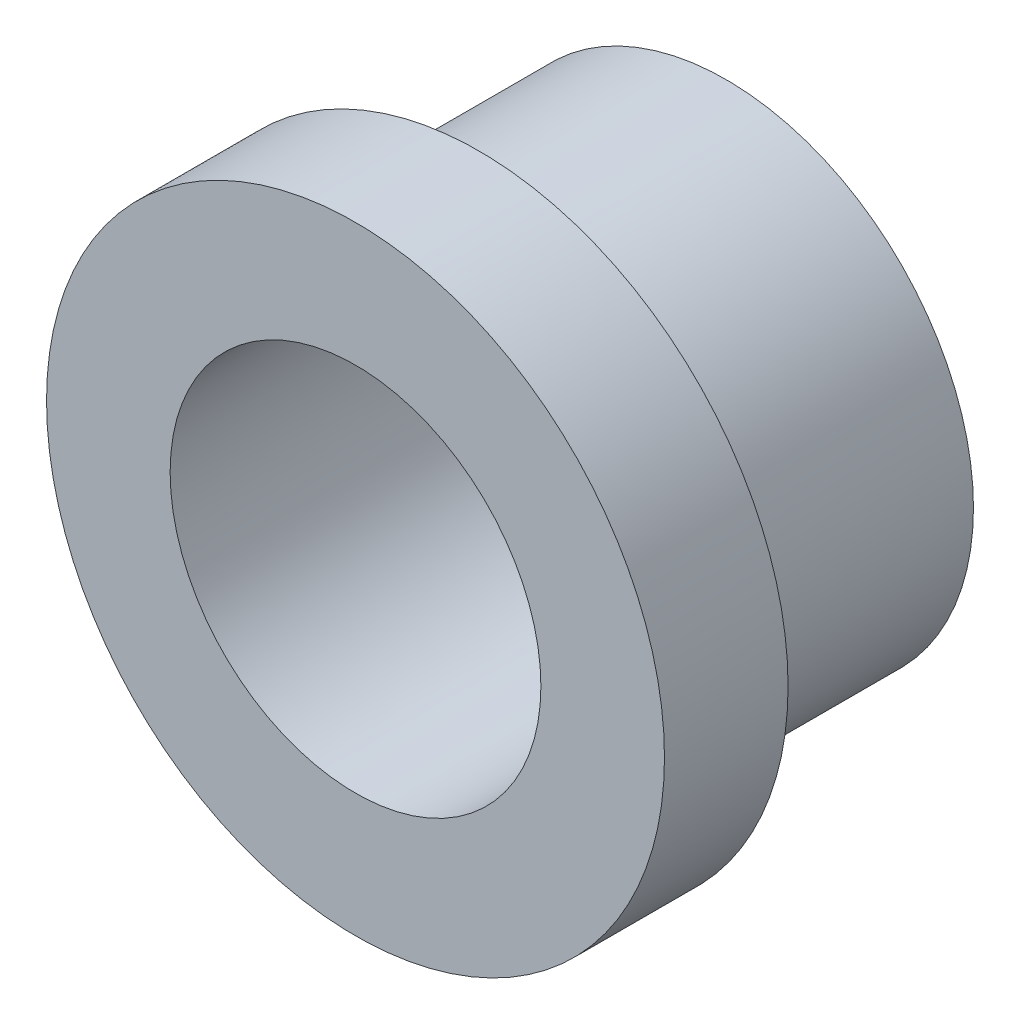
ISO-10303-21;
HEADER;
FILE_DESCRIPTION(('STEP AP214'),'2;1');
FILE_NAME('part.step','',(''),(''),'','','');
FILE_SCHEMA(('AUTOMOTIVE_DESIGN { 1 0 10303 214 1 1 1 1 }'));
ENDSEC;
DATA;
#1=APPLICATION_CONTEXT('core data for automotive mechanical design processes');
#2=APPLICATION_PROTOCOL_DEFINITION('international standard','automotive_design',2000,#1);
#3=PRODUCT_CONTEXT('',#1,'mechanical');
#4=PRODUCT('Part','Part','',(#3));
#5=PRODUCT_RELATED_PRODUCT_CATEGORY('part','',(#4));
#6=PRODUCT_DEFINITION_FORMATION('','',#4);
#7=PRODUCT_DEFINITION_CONTEXT('part definition',#1,'design');
#8=PRODUCT_DEFINITION('design','',#6,#7);
#9=PRODUCT_DEFINITION_SHAPE('','',#8);
#10=(LENGTH_UNIT() NAMED_UNIT(*) SI_UNIT(.MILLI.,.METRE.));
#11=(NAMED_UNIT(*) PLANE_ANGLE_UNIT() SI_UNIT($,.RADIAN.));
#12=(NAMED_UNIT(*) SI_UNIT($,.STERADIAN.) SOLID_ANGLE_UNIT());
#13=UNCERTAINTY_MEASURE_WITH_UNIT(LENGTH_MEASURE(1.E-05),#10,'distance_accuracy_value','');
#14=(GEOMETRIC_REPRESENTATION_CONTEXT(3) GLOBAL_UNCERTAINTY_ASSIGNED_CONTEXT((#13)) GLOBAL_UNIT_ASSIGNED_CONTEXT((#10,
#11,#12)) REPRESENTATION_CONTEXT('',''));
#15=CARTESIAN_POINT('',(0.,0.,0.));
#16=DIRECTION('',(0.,0.,1.));
#17=DIRECTION('',(1.,0.,0.));
#18=AXIS2_PLACEMENT_3D('',#15,#16,#17);
#19=CARTESIAN_POINT('',(0.,4.7625,0.));
#20=DIRECTION('',(0.,0.,-1.));
#21=DIRECTION('',(-1.,0.,0.));
#22=AXIS2_PLACEMENT_3D('',#19,#20,#21);
#23=PLANE('',#22);
#24=CARTESIAN_POINT('',(0.,0.,0.));
#25=DIRECTION('',(0.,0.,1.));
#26=DIRECTION('',(1.,0.,0.));
#27=AXIS2_PLACEMENT_3D('',#24,#25,#26);
#28=CIRCLE('',#27,4.7625);
#29=CARTESIAN_POINT('',(4.7625,0.,0.));
#30=VERTEX_POINT('',#29);
#31=EDGE_CURVE('E53',#30,#30,#28,.T.);
#32=ORIENTED_EDGE('',*,*,#31,.F.);
#33=EDGE_LOOP('',(#32));
#34=FACE_BOUND('',#33,.T.);
#35=CARTESIAN_POINT('',(0.,0.,0.));
#36=DIRECTION('',(0.,0.,1.));
#37=DIRECTION('',(1.,0.,0.));
#38=AXIS2_PLACEMENT_3D('',#35,#36,#37);
#39=CIRCLE('',#38,7.9375);
#40=CARTESIAN_POINT('',(7.9375,0.,0.));
#41=VERTEX_POINT('',#40);
#42=EDGE_CURVE('E10',#41,#41,#39,.T.);
#43=ORIENTED_EDGE('',*,*,#42,.T.);
#44=EDGE_LOOP('',(#43));
#45=FACE_BOUND('',#44,.T.);
#46=ADVANCED_FACE('F31',(#34,#45),#23,.F.);
#47=CARTESIAN_POINT('',(0.,0.,0.));
#48=DIRECTION('',(0.,0.,1.));
#49=DIRECTION('',(1.,0.,0.));
#50=AXIS2_PLACEMENT_3D('',#47,#48,#49);
#51=CYLINDRICAL_SURFACE('',#50,7.9375);
#52=ORIENTED_EDGE('',*,*,#42,.F.);
#53=EDGE_LOOP('',(#52));
#54=FACE_BOUND('',#53,.T.);
#55=CARTESIAN_POINT('',(0.,0.,-3.175));
#56=DIRECTION('',(0.,0.,1.));
#57=DIRECTION('',(1.,0.,0.));
#58=AXIS2_PLACEMENT_3D('',#55,#56,#57);
#59=CIRCLE('',#58,7.93750000000001);
#60=CARTESIAN_POINT('',(7.93750000000001,0.,-3.175));
#61=VERTEX_POINT('',#60);
#62=EDGE_CURVE('E37',#61,#61,#59,.T.);
#63=ORIENTED_EDGE('',*,*,#62,.T.);
#64=EDGE_LOOP('',(#63));
#65=FACE_BOUND('',#64,.T.);
#66=ADVANCED_FACE('F60',(#54,#65),#51,.T.);
#67=CARTESIAN_POINT('',(0.,7.93750000000001,-3.175));
#68=DIRECTION('',(0.,0.,1.));
#69=DIRECTION('',(1.,0.,0.));
#70=AXIS2_PLACEMENT_3D('',#67,#68,#69);
#71=PLANE('',#70);
#72=ORIENTED_EDGE('',*,*,#62,.F.);
#73=EDGE_LOOP('',(#72));
#74=FACE_BOUND('',#73,.T.);
#75=CARTESIAN_POINT('',(0.,0.,-3.175));
#76=DIRECTION('',(0.,0.,1.));
#77=DIRECTION('',(1.,0.,0.));
#78=AXIS2_PLACEMENT_3D('',#75,#76,#77);
#79=CIRCLE('',#78,6.35);
#80=CARTESIAN_POINT('',(6.35,0.,-3.175));
#81=VERTEX_POINT('',#80);
#82=EDGE_CURVE('E41',#81,#81,#79,.T.);
#83=ORIENTED_EDGE('',*,*,#82,.T.);
#84=EDGE_LOOP('',(#83));
#85=FACE_BOUND('',#84,.T.);
#86=ADVANCED_FACE('F64',(#74,#85),#71,.F.);
#87=CARTESIAN_POINT('',(0.,0.,0.));
#88=DIRECTION('',(0.,0.,1.));
#89=DIRECTION('',(1.,0.,0.));
#90=AXIS2_PLACEMENT_3D('',#87,#88,#89);
#91=CYLINDRICAL_SURFACE('',#90,6.35);
#92=ORIENTED_EDGE('',*,*,#82,.F.);
#93=EDGE_LOOP('',(#92));
#94=FACE_BOUND('',#93,.T.);
#95=CARTESIAN_POINT('',(0.,0.,-9.525));
#96=DIRECTION('',(0.,0.,1.));
#97=DIRECTION('',(1.,0.,0.));
#98=AXIS2_PLACEMENT_3D('',#95,#96,#97);
#99=CIRCLE('',#98,6.35);
#100=CARTESIAN_POINT('',(6.35,0.,-9.525));
#101=VERTEX_POINT('',#100);
#102=EDGE_CURVE('E45',#101,#101,#99,.T.);
#103=ORIENTED_EDGE('',*,*,#102,.T.);
#104=EDGE_LOOP('',(#103));
#105=FACE_BOUND('',#104,.T.);
#106=ADVANCED_FACE('F69',(#94,#105),#91,.T.);
#107=CARTESIAN_POINT('',(0.,6.35,-9.525));
#108=DIRECTION('',(0.,0.,1.));
#109=DIRECTION('',(1.,0.,0.));
#110=AXIS2_PLACEMENT_3D('',#107,#108,#109);
#111=PLANE('',#110);
#112=ORIENTED_EDGE('',*,*,#102,.F.);
#113=EDGE_LOOP('',(#112));
#114=FACE_BOUND('',#113,.T.);
#115=CARTESIAN_POINT('',(0.,0.,-9.525));
#116=DIRECTION('',(0.,0.,1.));
#117=DIRECTION('',(1.,0.,0.));
#118=AXIS2_PLACEMENT_3D('',#115,#116,#117);
#119=CIRCLE('',#118,4.7625);
#120=CARTESIAN_POINT('',(4.7625,0.,-9.525));
#121=VERTEX_POINT('',#120);
#122=EDGE_CURVE('E50',#121,#121,#119,.T.);
#123=ORIENTED_EDGE('',*,*,#122,.T.);
#124=EDGE_LOOP('',(#123));
#125=FACE_BOUND('',#124,.T.);
#126=ADVANCED_FACE('F75',(#114,#125),#111,.F.);
#127=CARTESIAN_POINT('',(0.,0.,0.));
#128=DIRECTION('',(0.,0.,1.));
#129=DIRECTION('',(1.,0.,0.));
#130=AXIS2_PLACEMENT_3D('',#127,#128,#129);
#131=CYLINDRICAL_SURFACE('',#130,4.7625);
#132=ORIENTED_EDGE('',*,*,#122,.F.);
#133=EDGE_LOOP('',(#132));
#134=FACE_BOUND('',#133,.T.);
#135=ORIENTED_EDGE('',*,*,#31,.T.);
#136=EDGE_LOOP('',(#135));
#137=FACE_BOUND('',#136,.T.);
#138=ADVANCED_FACE('F57',(#134,#137),#131,.F.);
#139=CLOSED_SHELL('',(#46,#66,#86,#106,#126,#138));
#140=MANIFOLD_SOLID_BREP('B2',#139);
#141=ADVANCED_BREP_SHAPE_REPRESENTATION('',(#18,#140),#14);
#142=SHAPE_DEFINITION_REPRESENTATION(#9,#141);
ENDSEC;
END-ISO-10303-21;
